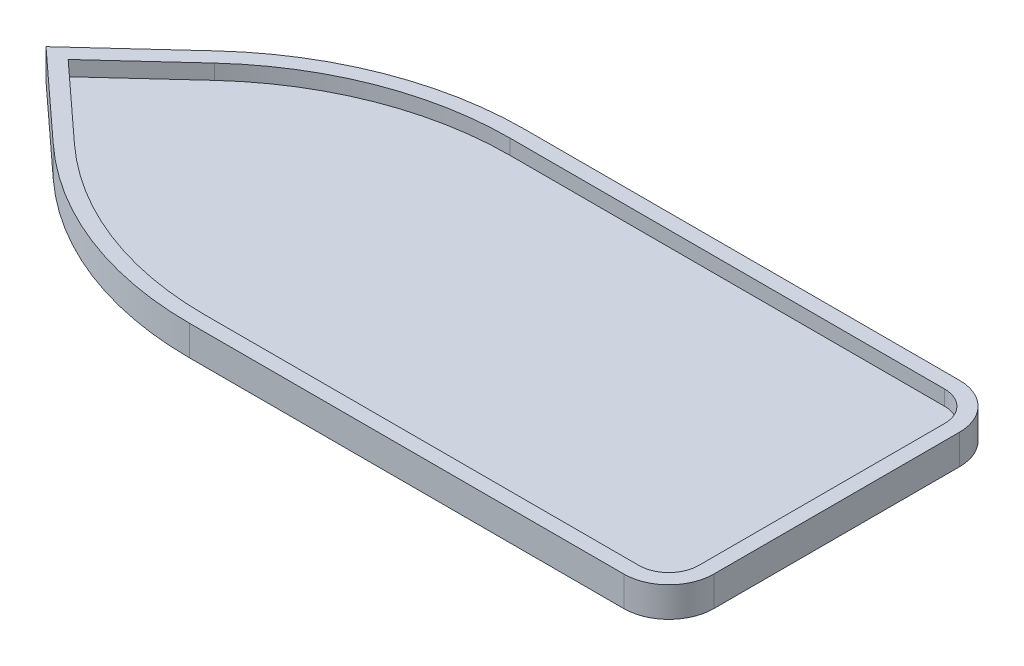
ISO-10303-21;
HEADER;
FILE_DESCRIPTION(('STEP AP214'),'2;1');
FILE_NAME('part.step','',(''),(''),'','','');
FILE_SCHEMA(('AUTOMOTIVE_DESIGN { 1 0 10303 214 1 1 1 1 }'));
ENDSEC;
DATA;
#1=APPLICATION_CONTEXT('core data for automotive mechanical design processes');
#2=APPLICATION_PROTOCOL_DEFINITION('international standard','automotive_design',2000,#1);
#3=PRODUCT_CONTEXT('',#1,'mechanical');
#4=PRODUCT('Part','Part','',(#3));
#5=PRODUCT_RELATED_PRODUCT_CATEGORY('part','',(#4));
#6=PRODUCT_DEFINITION_FORMATION('','',#4);
#7=PRODUCT_DEFINITION_CONTEXT('part definition',#1,'design');
#8=PRODUCT_DEFINITION('design','',#6,#7);
#9=PRODUCT_DEFINITION_SHAPE('','',#8);
#10=(LENGTH_UNIT() NAMED_UNIT(*) SI_UNIT(.MILLI.,.METRE.));
#11=(NAMED_UNIT(*) PLANE_ANGLE_UNIT() SI_UNIT($,.RADIAN.));
#12=(NAMED_UNIT(*) SI_UNIT($,.STERADIAN.) SOLID_ANGLE_UNIT());
#13=UNCERTAINTY_MEASURE_WITH_UNIT(LENGTH_MEASURE(1.E-05),#10,'distance_accuracy_value','');
#14=(GEOMETRIC_REPRESENTATION_CONTEXT(3) GLOBAL_UNCERTAINTY_ASSIGNED_CONTEXT((#13)) GLOBAL_UNIT_ASSIGNED_CONTEXT((#10,
#11,#12)) REPRESENTATION_CONTEXT('',''));
#15=CARTESIAN_POINT('',(0.,0.,0.));
#16=DIRECTION('',(0.,0.,1.));
#17=DIRECTION('',(1.,0.,0.));
#18=AXIS2_PLACEMENT_3D('',#15,#16,#17);
#19=CARTESIAN_POINT('',(-160.,10.,2.00000000000002));
#20=DIRECTION('',(0.,-1.,0.));
#21=DIRECTION('',(0.,0.,-1.));
#22=AXIS2_PLACEMENT_3D('',#19,#20,#21);
#23=PLANE('',#22);
#24=DIRECTION('',(0.736776758791174,0.,0.676136086675731));
#25=VECTOR('',#24,1.);
#26=CARTESIAN_POINT('',(-263.846039885977,10.,55.9999999999999));
#27=LINE('',#26,#25);
#28=CARTESIAN_POINT('',(-263.846039885977,10.,55.9999999999999));
#29=VERTEX_POINT('',#28);
#30=CARTESIAN_POINT('',(-234.37496953433,10.,83.0454434670292));
#31=VERTEX_POINT('',#30);
#32=EDGE_CURVE('E191',#29,#31,#27,.T.);
#33=ORIENTED_EDGE('',*,*,#32,.T.);
#34=CARTESIAN_POINT('',(-160.,10.,2.00000000000002));
#35=DIRECTION('',(0.,1.,0.));
#36=DIRECTION('',(0.,0.,-1.));
#37=AXIS2_PLACEMENT_3D('',#34,#35,#36);
#38=CIRCLE('',#37,110.);
#39=CARTESIAN_POINT('',(-160.,10.,112.));
#40=VERTEX_POINT('',#39);
#41=EDGE_CURVE('E114',#31,#40,#38,.T.);
#42=ORIENTED_EDGE('',*,*,#41,.T.);
#43=DIRECTION('',(1.,0.,0.));
#44=VECTOR('',#43,1.);
#45=CARTESIAN_POINT('',(-160.,10.,112.));
#46=LINE('',#45,#44);
#47=CARTESIAN_POINT('',(-15.0000000000001,10.,112.));
#48=VERTEX_POINT('',#47);
#49=EDGE_CURVE('E216',#40,#48,#46,.T.);
#50=ORIENTED_EDGE('',*,*,#49,.T.);
#51=CARTESIAN_POINT('',(-15.,10.,97.));
#52=DIRECTION('',(0.,1.,0.));
#53=DIRECTION('',(0.,0.,-1.));
#54=AXIS2_PLACEMENT_3D('',#51,#52,#53);
#55=CIRCLE('',#54,15.);
#56=CARTESIAN_POINT('',(0.,10.,96.9999999999999));
#57=VERTEX_POINT('',#56);
#58=EDGE_CURVE('E233',#48,#57,#55,.T.);
#59=ORIENTED_EDGE('',*,*,#58,.T.);
#60=DIRECTION('',(0.,0.,-1.));
#61=VECTOR('',#60,1.);
#62=CARTESIAN_POINT('',(0.,10.,15.0000000000001));
#63=LINE('',#62,#61);
#64=CARTESIAN_POINT('',(0.,10.,15.0000000000001));
#65=VERTEX_POINT('',#64);
#66=EDGE_CURVE('E231',#57,#65,#63,.T.);
#67=ORIENTED_EDGE('',*,*,#66,.T.);
#68=CARTESIAN_POINT('',(-15.,10.,15.));
#69=DIRECTION('',(0.,1.,0.));
#70=DIRECTION('',(0.,0.,1.));
#71=AXIS2_PLACEMENT_3D('',#68,#69,#70);
#72=CIRCLE('',#71,15.);
#73=CARTESIAN_POINT('',(-15.0000000000001,10.,0.));
#74=VERTEX_POINT('',#73);
#75=EDGE_CURVE('E139',#65,#74,#72,.T.);
#76=ORIENTED_EDGE('',*,*,#75,.T.);
#77=DIRECTION('',(-1.,0.,0.));
#78=VECTOR('',#77,1.);
#79=CARTESIAN_POINT('',(-15.0000000000001,10.,0.));
#80=LINE('',#79,#78);
#81=CARTESIAN_POINT('',(-160.,10.,0.));
#82=VERTEX_POINT('',#81);
#83=EDGE_CURVE('E132',#74,#82,#80,.T.);
#84=ORIENTED_EDGE('',*,*,#83,.T.);
#85=CARTESIAN_POINT('',(-160.,10.,110.));
#86=DIRECTION('',(0.,1.,0.));
#87=DIRECTION('',(0.,0.,-1.));
#88=AXIS2_PLACEMENT_3D('',#85,#86,#87);
#89=CIRCLE('',#88,110.);
#90=CARTESIAN_POINT('',(-234.37496953433,10.,28.9545565329707));
#91=VERTEX_POINT('',#90);
#92=EDGE_CURVE('E136',#82,#91,#89,.T.);
#93=ORIENTED_EDGE('',*,*,#92,.T.);
#94=DIRECTION('',(-0.736776758791175,0.,0.67613608667573));
#95=VECTOR('',#94,1.);
#96=CARTESIAN_POINT('',(-234.37496953433,10.,28.9545565329707));
#97=LINE('',#96,#95);
#98=EDGE_CURVE('E70',#91,#29,#97,.T.);
#99=ORIENTED_EDGE('',*,*,#98,.T.);
#100=EDGE_LOOP('',(#33,#42,#50,#59,#67,#76,#84,#93,#99));
#101=FACE_BOUND('',#100,.T.);
#102=DIRECTION('',(0.736776758791174,0.,0.676136086675731));
#103=VECTOR('',#102,1.);
#104=CARTESIAN_POINT('',(-230.994289100952,10.,79.3615596730733));
#105=LINE('',#104,#103);
#106=CARTESIAN_POINT('',(-256.451078873642,10.,55.9999999999999));
#107=VERTEX_POINT('',#106);
#108=CARTESIAN_POINT('',(-230.994289100952,10.,79.3615596730734));
#109=VERTEX_POINT('',#108);
#110=EDGE_CURVE('E276',#107,#109,#105,.T.);
#111=ORIENTED_EDGE('',*,*,#110,.F.);
#112=DIRECTION('',(-0.736776758791175,0.,0.67613608667573));
#113=VECTOR('',#112,1.);
#114=CARTESIAN_POINT('',(-177.192862821141,10.,-16.7348405052318));
#115=LINE('',#114,#113);
#116=CARTESIAN_POINT('',(-230.994289100952,10.,32.6384403269266));
#117=VERTEX_POINT('',#116);
#118=EDGE_CURVE('E245',#117,#107,#115,.T.);
#119=ORIENTED_EDGE('',*,*,#118,.F.);
#120=CARTESIAN_POINT('',(-160.,10.,110.));
#121=DIRECTION('',(0.,-1.,0.));
#122=DIRECTION('',(0.,0.,-1.));
#123=AXIS2_PLACEMENT_3D('',#120,#121,#122);
#124=CIRCLE('',#123,105.);
#125=CARTESIAN_POINT('',(-160.,10.,5.00000000000002));
#126=VERTEX_POINT('',#125);
#127=EDGE_CURVE('E249',#126,#117,#124,.F.);
#128=ORIENTED_EDGE('',*,*,#127,.F.);
#129=DIRECTION('',(-1.,0.,0.));
#130=VECTOR('',#129,1.);
#131=CARTESIAN_POINT('',(-160.,10.,5.00000000000002));
#132=LINE('',#131,#130);
#133=CARTESIAN_POINT('',(-15.0000000000001,10.,5.));
#134=VERTEX_POINT('',#133);
#135=EDGE_CURVE('E252',#134,#126,#132,.T.);
#136=ORIENTED_EDGE('',*,*,#135,.F.);
#137=CARTESIAN_POINT('',(-15.,10.,15.));
#138=DIRECTION('',(0.,-1.,0.));
#139=DIRECTION('',(0.,0.,-1.));
#140=AXIS2_PLACEMENT_3D('',#137,#138,#139);
#141=CIRCLE('',#140,9.99999999999999);
#142=CARTESIAN_POINT('',(-5.,10.,15.0000000000001));
#143=VERTEX_POINT('',#142);
#144=EDGE_CURVE('E256',#143,#134,#141,.F.);
#145=ORIENTED_EDGE('',*,*,#144,.F.);
#146=DIRECTION('',(0.,0.,-1.));
#147=VECTOR('',#146,1.);
#148=CARTESIAN_POINT('',(-5.,10.,2.));
#149=LINE('',#148,#147);
#150=CARTESIAN_POINT('',(-4.99999999999999,10.,96.9999999999999));
#151=VERTEX_POINT('',#150);
#152=EDGE_CURVE('E260',#151,#143,#149,.T.);
#153=ORIENTED_EDGE('',*,*,#152,.F.);
#154=CARTESIAN_POINT('',(-15.,10.,97.));
#155=DIRECTION('',(0.,-1.,0.));
#156=DIRECTION('',(0.,0.,-1.));
#157=AXIS2_PLACEMENT_3D('',#154,#155,#156);
#158=CIRCLE('',#157,10.);
#159=CARTESIAN_POINT('',(-15.0000000000001,10.,107.));
#160=VERTEX_POINT('',#159);
#161=EDGE_CURVE('E264',#160,#151,#158,.F.);
#162=ORIENTED_EDGE('',*,*,#161,.F.);
#163=DIRECTION('',(1.,0.,0.));
#164=VECTOR('',#163,1.);
#165=CARTESIAN_POINT('',(-160.,10.,107.));
#166=LINE('',#165,#164);
#167=CARTESIAN_POINT('',(-160.,10.,107.));
#168=VERTEX_POINT('',#167);
#169=EDGE_CURVE('E268',#168,#160,#166,.T.);
#170=ORIENTED_EDGE('',*,*,#169,.F.);
#171=CARTESIAN_POINT('',(-160.,10.,2.00000000000002));
#172=DIRECTION('',(0.,-1.,0.));
#173=DIRECTION('',(0.,0.,-1.));
#174=AXIS2_PLACEMENT_3D('',#171,#172,#173);
#175=CIRCLE('',#174,105.);
#176=EDGE_CURVE('E272',#109,#168,#175,.F.);
#177=ORIENTED_EDGE('',*,*,#176,.F.);
#178=EDGE_LOOP('',(#111,#119,#128,#136,#145,#153,#162,#170,#177));
#179=FACE_BOUND('',#178,.T.);
#180=ADVANCED_FACE('F45',(#101,#179),#23,.F.);
#181=CARTESIAN_POINT('',(-263.846039885977,10.,55.9999999999999));
#182=DIRECTION('',(0.676136086675731,0.,-0.736776758791174));
#183=DIRECTION('',(-0.736776758791174,0.,-0.676136086675731));
#184=AXIS2_PLACEMENT_3D('',#181,#182,#183);
#185=PLANE('',#184);
#186=DIRECTION('',(0.736776758791174,0.,0.676136086675731));
#187=VECTOR('',#186,1.);
#188=CARTESIAN_POINT('',(-263.846039885977,0.,55.9999999999999));
#189=LINE('',#188,#187);
#190=CARTESIAN_POINT('',(-263.846039885977,0.,55.9999999999999));
#191=VERTEX_POINT('',#190);
#192=CARTESIAN_POINT('',(-234.37496953433,0.,83.0454434670292));
#193=VERTEX_POINT('',#192);
#194=EDGE_CURVE('E164',#191,#193,#189,.T.);
#195=ORIENTED_EDGE('',*,*,#194,.T.);
#196=DIRECTION('',(0.,-1.,0.));
#197=VECTOR('',#196,1.);
#198=CARTESIAN_POINT('',(-234.37496953433,10.,83.0454434670292));
#199=LINE('',#198,#197);
#200=EDGE_CURVE('E11',#31,#193,#199,.T.);
#201=ORIENTED_EDGE('',*,*,#200,.F.);
#202=ORIENTED_EDGE('',*,*,#32,.F.);
#203=DIRECTION('',(0.,-1.,0.));
#204=VECTOR('',#203,1.);
#205=CARTESIAN_POINT('',(-263.846039885977,10.,55.9999999999999));
#206=LINE('',#205,#204);
#207=EDGE_CURVE('E160',#29,#191,#206,.T.);
#208=ORIENTED_EDGE('',*,*,#207,.T.);
#209=EDGE_LOOP('',(#195,#201,#202,#208));
#210=FACE_BOUND('',#209,.T.);
#211=ADVANCED_FACE('F47',(#210),#185,.F.);
#212=CARTESIAN_POINT('',(-160.,10.,2.00000000000002));
#213=DIRECTION('',(0.,-1.,0.));
#214=DIRECTION('',(0.,0.,-1.));
#215=AXIS2_PLACEMENT_3D('',#212,#213,#214);
#216=CYLINDRICAL_SURFACE('',#215,110.);
#217=CARTESIAN_POINT('',(-160.,0.,2.00000000000002));
#218=DIRECTION('',(0.,1.,0.));
#219=DIRECTION('',(0.,0.,-1.));
#220=AXIS2_PLACEMENT_3D('',#217,#218,#219);
#221=CIRCLE('',#220,110.);
#222=CARTESIAN_POINT('',(-160.,0.,112.));
#223=VERTEX_POINT('',#222);
#224=EDGE_CURVE('E168',#193,#223,#221,.T.);
#225=ORIENTED_EDGE('',*,*,#224,.T.);
#226=DIRECTION('',(0.,-1.,0.));
#227=VECTOR('',#226,1.);
#228=CARTESIAN_POINT('',(-160.,10.,112.));
#229=LINE('',#228,#227);
#230=EDGE_CURVE('E54',#40,#223,#229,.T.);
#231=ORIENTED_EDGE('',*,*,#230,.F.);
#232=ORIENTED_EDGE('',*,*,#41,.F.);
#233=ORIENTED_EDGE('',*,*,#200,.T.);
#234=EDGE_LOOP('',(#225,#231,#232,#233));
#235=FACE_BOUND('',#234,.T.);
#236=ADVANCED_FACE('F424',(#235),#216,.T.);
#237=CARTESIAN_POINT('',(-160.,10.,112.));
#238=DIRECTION('',(0.,0.,-1.));
#239=DIRECTION('',(-1.,0.,0.));
#240=AXIS2_PLACEMENT_3D('',#237,#238,#239);
#241=PLANE('',#240);
#242=DIRECTION('',(1.,0.,0.));
#243=VECTOR('',#242,1.);
#244=CARTESIAN_POINT('',(-160.,0.,112.));
#245=LINE('',#244,#243);
#246=CARTESIAN_POINT('',(-15.0000000000001,0.,112.));
#247=VERTEX_POINT('',#246);
#248=EDGE_CURVE('E172',#223,#247,#245,.T.);
#249=ORIENTED_EDGE('',*,*,#248,.T.);
#250=DIRECTION('',(0.,-1.,0.));
#251=VECTOR('',#250,1.);
#252=CARTESIAN_POINT('',(-15.0000000000001,10.,112.));
#253=LINE('',#252,#251);
#254=EDGE_CURVE('E206',#48,#247,#253,.T.);
#255=ORIENTED_EDGE('',*,*,#254,.F.);
#256=ORIENTED_EDGE('',*,*,#49,.F.);
#257=ORIENTED_EDGE('',*,*,#230,.T.);
#258=EDGE_LOOP('',(#249,#255,#256,#257));
#259=FACE_BOUND('',#258,.T.);
#260=ADVANCED_FACE('F214',(#259),#241,.F.);
#261=CARTESIAN_POINT('',(-15.,10.,97.));
#262=DIRECTION('',(0.,-1.,0.));
#263=DIRECTION('',(0.,0.,-1.));
#264=AXIS2_PLACEMENT_3D('',#261,#262,#263);
#265=CYLINDRICAL_SURFACE('',#264,15.);
#266=CARTESIAN_POINT('',(-15.,0.,97.));
#267=DIRECTION('',(0.,1.,0.));
#268=DIRECTION('',(0.,0.,-1.));
#269=AXIS2_PLACEMENT_3D('',#266,#267,#268);
#270=CIRCLE('',#269,15.);
#271=CARTESIAN_POINT('',(0.,0.,96.9999999999999));
#272=VERTEX_POINT('',#271);
#273=EDGE_CURVE('E175',#247,#272,#270,.T.);
#274=ORIENTED_EDGE('',*,*,#273,.T.);
#275=DIRECTION('',(0.,-1.,0.));
#276=VECTOR('',#275,1.);
#277=CARTESIAN_POINT('',(0.,10.,96.9999999999999));
#278=LINE('',#277,#276);
#279=EDGE_CURVE('E202',#57,#272,#278,.T.);
#280=ORIENTED_EDGE('',*,*,#279,.F.);
#281=ORIENTED_EDGE('',*,*,#58,.F.);
#282=ORIENTED_EDGE('',*,*,#254,.T.);
#283=EDGE_LOOP('',(#274,#280,#281,#282));
#284=FACE_BOUND('',#283,.T.);
#285=ADVANCED_FACE('F225',(#284),#265,.T.);
#286=CARTESIAN_POINT('',(0.,10.,15.0000000000001));
#287=DIRECTION('',(-1.,0.,0.));
#288=DIRECTION('',(0.,0.,1.));
#289=AXIS2_PLACEMENT_3D('',#286,#287,#288);
#290=PLANE('',#289);
#291=DIRECTION('',(0.,0.,-1.));
#292=VECTOR('',#291,1.);
#293=CARTESIAN_POINT('',(0.,0.,15.0000000000001));
#294=LINE('',#293,#292);
#295=CARTESIAN_POINT('',(0.,0.,15.0000000000001));
#296=VERTEX_POINT('',#295);
#297=EDGE_CURVE('E178',#272,#296,#294,.T.);
#298=ORIENTED_EDGE('',*,*,#297,.T.);
#299=DIRECTION('',(0.,-1.,0.));
#300=VECTOR('',#299,1.);
#301=CARTESIAN_POINT('',(0.,10.,15.0000000000001));
#302=LINE('',#301,#300);
#303=EDGE_CURVE('E198',#65,#296,#302,.T.);
#304=ORIENTED_EDGE('',*,*,#303,.F.);
#305=ORIENTED_EDGE('',*,*,#66,.F.);
#306=ORIENTED_EDGE('',*,*,#279,.T.);
#307=EDGE_LOOP('',(#298,#304,#305,#306));
#308=FACE_BOUND('',#307,.T.);
#309=ADVANCED_FACE('F229',(#308),#290,.F.);
#310=CARTESIAN_POINT('',(-15.,10.,15.));
#311=DIRECTION('',(0.,-1.,0.));
#312=DIRECTION('',(0.,0.,-1.));
#313=AXIS2_PLACEMENT_3D('',#310,#311,#312);
#314=CYLINDRICAL_SURFACE('',#313,15.);
#315=CARTESIAN_POINT('',(-15.,0.,15.));
#316=DIRECTION('',(0.,1.,0.));
#317=DIRECTION('',(0.,0.,1.));
#318=AXIS2_PLACEMENT_3D('',#315,#316,#317);
#319=CIRCLE('',#318,15.);
#320=CARTESIAN_POINT('',(-15.0000000000001,0.,0.));
#321=VERTEX_POINT('',#320);
#322=EDGE_CURVE('E181',#296,#321,#319,.T.);
#323=ORIENTED_EDGE('',*,*,#322,.T.);
#324=DIRECTION('',(0.,-1.,0.));
#325=VECTOR('',#324,1.);
#326=CARTESIAN_POINT('',(-15.0000000000001,10.,0.));
#327=LINE('',#326,#325);
#328=EDGE_CURVE('E153',#74,#321,#327,.T.);
#329=ORIENTED_EDGE('',*,*,#328,.F.);
#330=ORIENTED_EDGE('',*,*,#75,.F.);
#331=ORIENTED_EDGE('',*,*,#303,.T.);
#332=EDGE_LOOP('',(#323,#329,#330,#331));
#333=FACE_BOUND('',#332,.T.);
#334=ADVANCED_FACE('F437',(#333),#314,.T.);
#335=CARTESIAN_POINT('',(-15.0000000000001,10.,0.));
#336=DIRECTION('',(0.,0.,1.));
#337=DIRECTION('',(1.,0.,0.));
#338=AXIS2_PLACEMENT_3D('',#335,#336,#337);
#339=PLANE('',#338);
#340=DIRECTION('',(-1.,0.,0.));
#341=VECTOR('',#340,1.);
#342=CARTESIAN_POINT('',(-15.0000000000001,0.,0.));
#343=LINE('',#342,#341);
#344=CARTESIAN_POINT('',(-160.,0.,0.));
#345=VERTEX_POINT('',#344);
#346=EDGE_CURVE('E149',#321,#345,#343,.T.);
#347=ORIENTED_EDGE('',*,*,#346,.T.);
#348=DIRECTION('',(0.,-1.,0.));
#349=VECTOR('',#348,1.);
#350=CARTESIAN_POINT('',(-160.,10.,0.));
#351=LINE('',#350,#349);
#352=EDGE_CURVE('E146',#82,#345,#351,.T.);
#353=ORIENTED_EDGE('',*,*,#352,.F.);
#354=ORIENTED_EDGE('',*,*,#83,.F.);
#355=ORIENTED_EDGE('',*,*,#328,.T.);
#356=EDGE_LOOP('',(#347,#353,#354,#355));
#357=FACE_BOUND('',#356,.T.);
#358=ADVANCED_FACE('F147',(#357),#339,.F.);
#359=CARTESIAN_POINT('',(-160.,10.,110.));
#360=DIRECTION('',(0.,-1.,0.));
#361=DIRECTION('',(0.,0.,-1.));
#362=AXIS2_PLACEMENT_3D('',#359,#360,#361);
#363=CYLINDRICAL_SURFACE('',#362,110.);
#364=CARTESIAN_POINT('',(-160.,0.,110.));
#365=DIRECTION('',(0.,1.,0.));
#366=DIRECTION('',(0.,0.,-1.));
#367=AXIS2_PLACEMENT_3D('',#364,#365,#366);
#368=CIRCLE('',#367,110.);
#369=CARTESIAN_POINT('',(-234.37496953433,0.,28.9545565329707));
#370=VERTEX_POINT('',#369);
#371=EDGE_CURVE('E186',#345,#370,#368,.T.);
#372=ORIENTED_EDGE('',*,*,#371,.T.);
#373=DIRECTION('',(0.,-1.,0.));
#374=VECTOR('',#373,1.);
#375=CARTESIAN_POINT('',(-234.37496953433,10.,28.9545565329707));
#376=LINE('',#375,#374);
#377=EDGE_CURVE('E154',#91,#370,#376,.T.);
#378=ORIENTED_EDGE('',*,*,#377,.F.);
#379=ORIENTED_EDGE('',*,*,#92,.F.);
#380=ORIENTED_EDGE('',*,*,#352,.T.);
#381=EDGE_LOOP('',(#372,#378,#379,#380));
#382=FACE_BOUND('',#381,.T.);
#383=ADVANCED_FACE('F156',(#382),#363,.T.);
#384=CARTESIAN_POINT('',(-234.37496953433,10.,28.9545565329707));
#385=DIRECTION('',(0.67613608667573,0.,0.736776758791175));
#386=DIRECTION('',(0.736776758791175,0.,-0.67613608667573));
#387=AXIS2_PLACEMENT_3D('',#384,#385,#386);
#388=PLANE('',#387);
#389=DIRECTION('',(-0.736776758791175,0.,0.67613608667573));
#390=VECTOR('',#389,1.);
#391=CARTESIAN_POINT('',(-234.37496953433,0.,28.9545565329707));
#392=LINE('',#391,#390);
#393=EDGE_CURVE('E106',#370,#191,#392,.T.);
#394=ORIENTED_EDGE('',*,*,#393,.T.);
#395=ORIENTED_EDGE('',*,*,#207,.F.);
#396=ORIENTED_EDGE('',*,*,#98,.F.);
#397=ORIENTED_EDGE('',*,*,#377,.T.);
#398=EDGE_LOOP('',(#394,#395,#396,#397));
#399=FACE_BOUND('',#398,.T.);
#400=ADVANCED_FACE('F430',(#399),#388,.F.);
#401=CARTESIAN_POINT('',(-160.,0.,2.00000000000002));
#402=DIRECTION('',(0.,-1.,0.));
#403=DIRECTION('',(0.,0.,-1.));
#404=AXIS2_PLACEMENT_3D('',#401,#402,#403);
#405=PLANE('',#404);
#406=ORIENTED_EDGE('',*,*,#194,.F.);
#407=ORIENTED_EDGE('',*,*,#393,.F.);
#408=ORIENTED_EDGE('',*,*,#371,.F.);
#409=ORIENTED_EDGE('',*,*,#346,.F.);
#410=ORIENTED_EDGE('',*,*,#322,.F.);
#411=ORIENTED_EDGE('',*,*,#297,.F.);
#412=ORIENTED_EDGE('',*,*,#273,.F.);
#413=ORIENTED_EDGE('',*,*,#248,.F.);
#414=ORIENTED_EDGE('',*,*,#224,.F.);
#415=EDGE_LOOP('',(#406,#407,#408,#409,#410,#411,#412,#413,#414));
#416=FACE_BOUND('',#415,.T.);
#417=ADVANCED_FACE('F220',(#416),#405,.T.);
#418=CARTESIAN_POINT('',(-260.465359452599,10.,52.3161162060441));
#419=DIRECTION('',(0.676136086675731,0.,-0.736776758791174));
#420=DIRECTION('',(-0.736776758791174,0.,-0.676136086675731));
#421=AXIS2_PLACEMENT_3D('',#418,#419,#420);
#422=PLANE('',#421);
#423=DIRECTION('',(0.736776758791174,0.,0.676136086675731));
#424=VECTOR('',#423,1.);
#425=CARTESIAN_POINT('',(-230.994289100952,5.,79.3615596730733));
#426=LINE('',#425,#424);
#427=CARTESIAN_POINT('',(-256.451078873642,5.,55.9999999999999));
#428=VERTEX_POINT('',#427);
#429=CARTESIAN_POINT('',(-230.994289100952,5.,79.3615596730734));
#430=VERTEX_POINT('',#429);
#431=EDGE_CURVE('E338',#428,#430,#426,.T.);
#432=ORIENTED_EDGE('',*,*,#431,.F.);
#433=DIRECTION('',(0.,-1.,0.));
#434=VECTOR('',#433,1.);
#435=CARTESIAN_POINT('',(-256.451078873642,10.,55.9999999999999));
#436=LINE('',#435,#434);
#437=EDGE_CURVE('E248',#107,#428,#436,.T.);
#438=ORIENTED_EDGE('',*,*,#437,.F.);
#439=ORIENTED_EDGE('',*,*,#110,.T.);
#440=DIRECTION('',(0.,-1.,0.));
#441=VECTOR('',#440,1.);
#442=CARTESIAN_POINT('',(-230.994289100952,10.,79.3615596730734));
#443=LINE('',#442,#441);
#444=EDGE_CURVE('E169',#109,#430,#443,.T.);
#445=ORIENTED_EDGE('',*,*,#444,.T.);
#446=EDGE_LOOP('',(#432,#438,#439,#445));
#447=FACE_BOUND('',#446,.T.);
#448=ADVANCED_FACE('F357',(#447),#422,.T.);
#449=CARTESIAN_POINT('',(-160.,10.,2.00000000000002));
#450=DIRECTION('',(0.,-1.,0.));
#451=DIRECTION('',(0.,0.,-1.));
#452=AXIS2_PLACEMENT_3D('',#449,#450,#451);
#453=CYLINDRICAL_SURFACE('',#452,105.);
#454=CARTESIAN_POINT('',(-160.,5.,2.00000000000002));
#455=DIRECTION('',(0.,-1.,0.));
#456=DIRECTION('',(0.,0.,-1.));
#457=AXIS2_PLACEMENT_3D('',#454,#455,#456);
#458=CIRCLE('',#457,105.);
#459=CARTESIAN_POINT('',(-160.,5.,107.));
#460=VERTEX_POINT('',#459);
#461=EDGE_CURVE('E331',#430,#460,#458,.F.);
#462=ORIENTED_EDGE('',*,*,#461,.F.);
#463=ORIENTED_EDGE('',*,*,#444,.F.);
#464=ORIENTED_EDGE('',*,*,#176,.T.);
#465=DIRECTION('',(0.,1.,0.));
#466=VECTOR('',#465,1.);
#467=CARTESIAN_POINT('',(-160.,10.,107.));
#468=LINE('',#467,#466);
#469=EDGE_CURVE('E327',#168,#460,#468,.F.);
#470=ORIENTED_EDGE('',*,*,#469,.T.);
#471=EDGE_LOOP('',(#462,#463,#464,#470));
#472=FACE_BOUND('',#471,.T.);
#473=ADVANCED_FACE('F388',(#472),#453,.F.);
#474=CARTESIAN_POINT('',(-160.,10.,107.));
#475=DIRECTION('',(0.,0.,-1.));
#476=DIRECTION('',(-1.,0.,0.));
#477=AXIS2_PLACEMENT_3D('',#474,#475,#476);
#478=PLANE('',#477);
#479=DIRECTION('',(1.,0.,0.));
#480=VECTOR('',#479,1.);
#481=CARTESIAN_POINT('',(-160.,5.,107.));
#482=LINE('',#481,#480);
#483=CARTESIAN_POINT('',(-15.0000000000001,5.,107.));
#484=VERTEX_POINT('',#483);
#485=EDGE_CURVE('E323',#460,#484,#482,.T.);
#486=ORIENTED_EDGE('',*,*,#485,.F.);
#487=ORIENTED_EDGE('',*,*,#469,.F.);
#488=ORIENTED_EDGE('',*,*,#169,.T.);
#489=DIRECTION('',(0.,-1.,0.));
#490=VECTOR('',#489,1.);
#491=CARTESIAN_POINT('',(-15.0000000000001,10.,107.));
#492=LINE('',#491,#490);
#493=EDGE_CURVE('E319',#160,#484,#492,.T.);
#494=ORIENTED_EDGE('',*,*,#493,.T.);
#495=EDGE_LOOP('',(#486,#487,#488,#494));
#496=FACE_BOUND('',#495,.T.);
#497=ADVANCED_FACE('F394',(#496),#478,.T.);
#498=CARTESIAN_POINT('',(-15.,10.,97.));
#499=DIRECTION('',(0.,-1.,0.));
#500=DIRECTION('',(0.,0.,-1.));
#501=AXIS2_PLACEMENT_3D('',#498,#499,#500);
#502=CYLINDRICAL_SURFACE('',#501,10.);
#503=CARTESIAN_POINT('',(-15.,5.,97.));
#504=DIRECTION('',(0.,-1.,0.));
#505=DIRECTION('',(0.,0.,-1.));
#506=AXIS2_PLACEMENT_3D('',#503,#504,#505);
#507=CIRCLE('',#506,10.);
#508=CARTESIAN_POINT('',(-4.99999999999999,5.,96.9999999999999));
#509=VERTEX_POINT('',#508);
#510=EDGE_CURVE('E315',#484,#509,#507,.F.);
#511=ORIENTED_EDGE('',*,*,#510,.F.);
#512=ORIENTED_EDGE('',*,*,#493,.F.);
#513=ORIENTED_EDGE('',*,*,#161,.T.);
#514=DIRECTION('',(0.,1.,0.));
#515=VECTOR('',#514,1.);
#516=CARTESIAN_POINT('',(-4.99999999999999,10.,96.9999999999999));
#517=LINE('',#516,#515);
#518=EDGE_CURVE('E311',#151,#509,#517,.F.);
#519=ORIENTED_EDGE('',*,*,#518,.T.);
#520=EDGE_LOOP('',(#511,#512,#513,#519));
#521=FACE_BOUND('',#520,.T.);
#522=ADVANCED_FACE('F506',(#521),#502,.F.);
#523=CARTESIAN_POINT('',(-5.,10.,15.0000000000001));
#524=DIRECTION('',(-1.,0.,0.));
#525=DIRECTION('',(0.,0.,1.));
#526=AXIS2_PLACEMENT_3D('',#523,#524,#525);
#527=PLANE('',#526);
#528=DIRECTION('',(0.,0.,-1.));
#529=VECTOR('',#528,1.);
#530=CARTESIAN_POINT('',(-5.,5.,2.));
#531=LINE('',#530,#529);
#532=CARTESIAN_POINT('',(-5.,5.,15.0000000000001));
#533=VERTEX_POINT('',#532);
#534=EDGE_CURVE('E307',#509,#533,#531,.T.);
#535=ORIENTED_EDGE('',*,*,#534,.F.);
#536=ORIENTED_EDGE('',*,*,#518,.F.);
#537=ORIENTED_EDGE('',*,*,#152,.T.);
#538=DIRECTION('',(0.,-1.,0.));
#539=VECTOR('',#538,1.);
#540=CARTESIAN_POINT('',(-5.,10.,15.0000000000001));
#541=LINE('',#540,#539);
#542=EDGE_CURVE('E303',#143,#533,#541,.T.);
#543=ORIENTED_EDGE('',*,*,#542,.T.);
#544=EDGE_LOOP('',(#535,#536,#537,#543));
#545=FACE_BOUND('',#544,.T.);
#546=ADVANCED_FACE('F514',(#545),#527,.T.);
#547=CARTESIAN_POINT('',(-15.,10.,15.));
#548=DIRECTION('',(0.,-1.,0.));
#549=DIRECTION('',(0.,0.,-1.));
#550=AXIS2_PLACEMENT_3D('',#547,#548,#549);
#551=CYLINDRICAL_SURFACE('',#550,9.99999999999999);
#552=CARTESIAN_POINT('',(-15.,5.,15.));
#553=DIRECTION('',(0.,-1.,0.));
#554=DIRECTION('',(0.,0.,-1.));
#555=AXIS2_PLACEMENT_3D('',#552,#553,#554);
#556=CIRCLE('',#555,9.99999999999999);
#557=CARTESIAN_POINT('',(-15.0000000000001,5.,5.));
#558=VERTEX_POINT('',#557);
#559=EDGE_CURVE('E299',#533,#558,#556,.F.);
#560=ORIENTED_EDGE('',*,*,#559,.F.);
#561=ORIENTED_EDGE('',*,*,#542,.F.);
#562=ORIENTED_EDGE('',*,*,#144,.T.);
#563=DIRECTION('',(0.,1.,0.));
#564=VECTOR('',#563,1.);
#565=CARTESIAN_POINT('',(-15.0000000000001,10.,5.));
#566=LINE('',#565,#564);
#567=EDGE_CURVE('E295',#134,#558,#566,.F.);
#568=ORIENTED_EDGE('',*,*,#567,.T.);
#569=EDGE_LOOP('',(#560,#561,#562,#568));
#570=FACE_BOUND('',#569,.T.);
#571=ADVANCED_FACE('F417',(#570),#551,.F.);
#572=CARTESIAN_POINT('',(-15.0000000000001,10.,5.));
#573=DIRECTION('',(0.,0.,1.));
#574=DIRECTION('',(1.,0.,0.));
#575=AXIS2_PLACEMENT_3D('',#572,#573,#574);
#576=PLANE('',#575);
#577=DIRECTION('',(-1.,0.,0.));
#578=VECTOR('',#577,1.);
#579=CARTESIAN_POINT('',(-160.,5.,5.00000000000002));
#580=LINE('',#579,#578);
#581=CARTESIAN_POINT('',(-160.,5.,5.));
#582=VERTEX_POINT('',#581);
#583=EDGE_CURVE('E291',#558,#582,#580,.T.);
#584=ORIENTED_EDGE('',*,*,#583,.F.);
#585=ORIENTED_EDGE('',*,*,#567,.F.);
#586=ORIENTED_EDGE('',*,*,#135,.T.);
#587=DIRECTION('',(0.,-1.,0.));
#588=VECTOR('',#587,1.);
#589=CARTESIAN_POINT('',(-160.,10.,5.));
#590=LINE('',#589,#588);
#591=EDGE_CURVE('E287',#126,#582,#590,.T.);
#592=ORIENTED_EDGE('',*,*,#591,.T.);
#593=EDGE_LOOP('',(#584,#585,#586,#592));
#594=FACE_BOUND('',#593,.T.);
#595=ADVANCED_FACE('F407',(#594),#576,.T.);
#596=CARTESIAN_POINT('',(-160.,10.,110.));
#597=DIRECTION('',(0.,-1.,0.));
#598=DIRECTION('',(0.,0.,-1.));
#599=AXIS2_PLACEMENT_3D('',#596,#597,#598);
#600=CYLINDRICAL_SURFACE('',#599,105.);
#601=CARTESIAN_POINT('',(-160.,5.,110.));
#602=DIRECTION('',(0.,-1.,0.));
#603=DIRECTION('',(0.,0.,-1.));
#604=AXIS2_PLACEMENT_3D('',#601,#602,#603);
#605=CIRCLE('',#604,105.);
#606=CARTESIAN_POINT('',(-230.994289100952,5.,32.6384403269266));
#607=VERTEX_POINT('',#606);
#608=EDGE_CURVE('E284',#582,#607,#605,.F.);
#609=ORIENTED_EDGE('',*,*,#608,.F.);
#610=ORIENTED_EDGE('',*,*,#591,.F.);
#611=ORIENTED_EDGE('',*,*,#127,.T.);
#612=DIRECTION('',(0.,1.,0.));
#613=VECTOR('',#612,1.);
#614=CARTESIAN_POINT('',(-230.994289100952,10.,32.6384403269266));
#615=LINE('',#614,#613);
#616=EDGE_CURVE('E61',#117,#607,#615,.F.);
#617=ORIENTED_EDGE('',*,*,#616,.T.);
#618=EDGE_LOOP('',(#609,#610,#611,#617));
#619=FACE_BOUND('',#618,.T.);
#620=ADVANCED_FACE('F409',(#619),#600,.F.);
#621=CARTESIAN_POINT('',(-230.994289100952,10.,32.6384403269266));
#622=DIRECTION('',(0.67613608667573,0.,0.736776758791175));
#623=DIRECTION('',(0.736776758791175,0.,-0.67613608667573));
#624=AXIS2_PLACEMENT_3D('',#621,#622,#623);
#625=PLANE('',#624);
#626=DIRECTION('',(-0.736776758791175,0.,0.67613608667573));
#627=VECTOR('',#626,1.);
#628=CARTESIAN_POINT('',(-177.192862821141,5.,-16.7348405052318));
#629=LINE('',#628,#627);
#630=EDGE_CURVE('E280',#607,#428,#629,.T.);
#631=ORIENTED_EDGE('',*,*,#630,.F.);
#632=ORIENTED_EDGE('',*,*,#616,.F.);
#633=ORIENTED_EDGE('',*,*,#118,.T.);
#634=ORIENTED_EDGE('',*,*,#437,.T.);
#635=EDGE_LOOP('',(#631,#632,#633,#634));
#636=FACE_BOUND('',#635,.T.);
#637=ADVANCED_FACE('F383',(#636),#625,.T.);
#638=CARTESIAN_POINT('',(-160.,5.,2.00000000000002));
#639=DIRECTION('',(0.,-1.,0.));
#640=DIRECTION('',(0.,0.,-1.));
#641=AXIS2_PLACEMENT_3D('',#638,#639,#640);
#642=PLANE('',#641);
#643=ORIENTED_EDGE('',*,*,#431,.T.);
#644=ORIENTED_EDGE('',*,*,#461,.T.);
#645=ORIENTED_EDGE('',*,*,#485,.T.);
#646=ORIENTED_EDGE('',*,*,#510,.T.);
#647=ORIENTED_EDGE('',*,*,#534,.T.);
#648=ORIENTED_EDGE('',*,*,#559,.T.);
#649=ORIENTED_EDGE('',*,*,#583,.T.);
#650=ORIENTED_EDGE('',*,*,#608,.T.);
#651=ORIENTED_EDGE('',*,*,#630,.T.);
#652=EDGE_LOOP('',(#643,#644,#645,#646,#647,#648,#649,#650,#651));
#653=FACE_BOUND('',#652,.T.);
#654=ADVANCED_FACE('F350',(#653),#642,.F.);
#655=CLOSED_SHELL('',(#180,#211,#236,#260,#285,#309,#334,#358,#383,#400,#417,#448,#473,#497,
#522,#546,#571,#595,#620,#637,#654));
#656=MANIFOLD_SOLID_BREP('B2',#655);
#657=ADVANCED_BREP_SHAPE_REPRESENTATION('',(#18,#656),#14);
#658=SHAPE_DEFINITION_REPRESENTATION(#9,#657);
ENDSEC;
END-ISO-10303-21;
